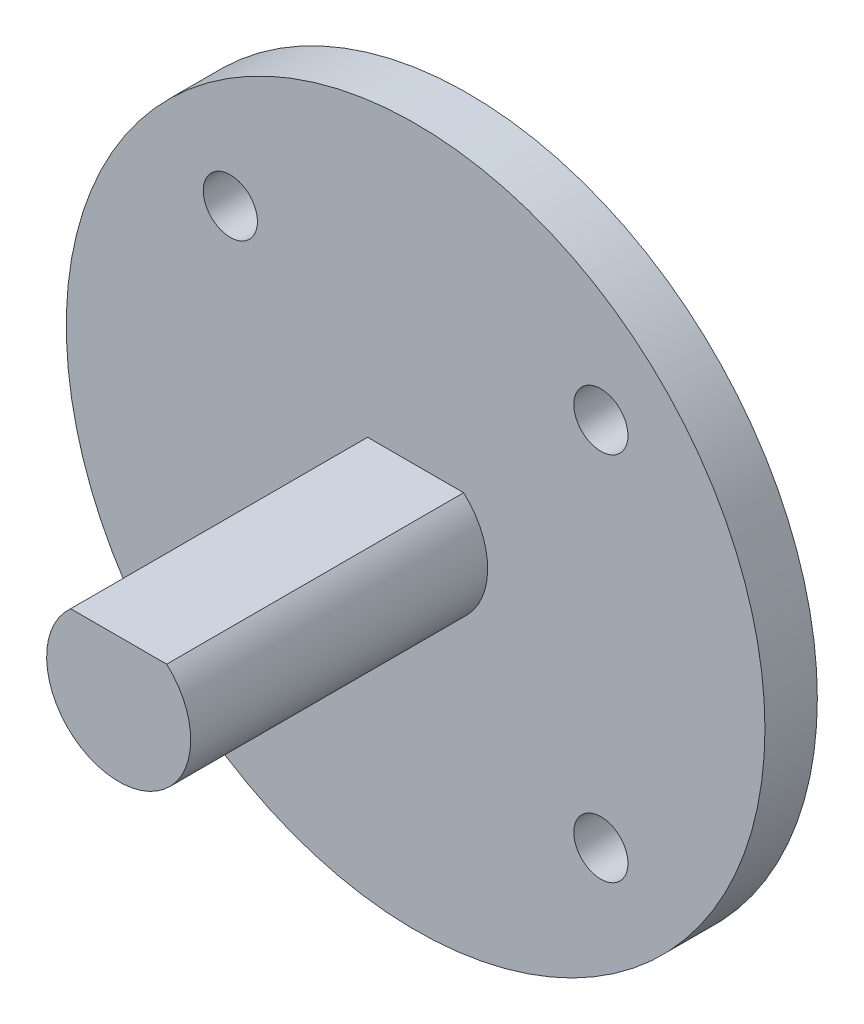
ISO-10303-21;
HEADER;
FILE_DESCRIPTION(('STEP AP214'),'2;1');
FILE_NAME('part.step','',(''),(''),'','','');
FILE_SCHEMA(('AUTOMOTIVE_DESIGN { 1 0 10303 214 1 1 1 1 }'));
ENDSEC;
DATA;
#1=APPLICATION_CONTEXT('core data for automotive mechanical design processes');
#2=APPLICATION_PROTOCOL_DEFINITION('international standard','automotive_design',2000,#1);
#3=PRODUCT_CONTEXT('',#1,'mechanical');
#4=PRODUCT('Part','Part','',(#3));
#5=PRODUCT_RELATED_PRODUCT_CATEGORY('part','',(#4));
#6=PRODUCT_DEFINITION_FORMATION('','',#4);
#7=PRODUCT_DEFINITION_CONTEXT('part definition',#1,'design');
#8=PRODUCT_DEFINITION('design','',#6,#7);
#9=PRODUCT_DEFINITION_SHAPE('','',#8);
#10=(LENGTH_UNIT() NAMED_UNIT(*) SI_UNIT(.MILLI.,.METRE.));
#11=(NAMED_UNIT(*) PLANE_ANGLE_UNIT() SI_UNIT($,.RADIAN.));
#12=(NAMED_UNIT(*) SI_UNIT($,.STERADIAN.) SOLID_ANGLE_UNIT());
#13=UNCERTAINTY_MEASURE_WITH_UNIT(LENGTH_MEASURE(1.E-05),#10,'distance_accuracy_value','');
#14=(GEOMETRIC_REPRESENTATION_CONTEXT(3) GLOBAL_UNCERTAINTY_ASSIGNED_CONTEXT((#13)) GLOBAL_UNIT_ASSIGNED_CONTEXT((#10,
#11,#12)) REPRESENTATION_CONTEXT('',''));
#15=CARTESIAN_POINT('',(0.,0.,0.));
#16=DIRECTION('',(0.,0.,1.));
#17=DIRECTION('',(1.,0.,0.));
#18=AXIS2_PLACEMENT_3D('',#15,#16,#17);
#19=CARTESIAN_POINT('',(10.6066017177982,10.6066017177982,3.));
#20=DIRECTION('',(0.,0.,-1.));
#21=DIRECTION('',(-1.,0.,0.));
#22=AXIS2_PLACEMENT_3D('',#19,#20,#21);
#23=CYLINDRICAL_SURFACE('',#22,1.55);
#24=CARTESIAN_POINT('',(10.6066017177982,10.6066017177982,3.));
#25=DIRECTION('',(0.,0.,1.));
#26=DIRECTION('',(1.,0.,0.));
#27=AXIS2_PLACEMENT_3D('',#24,#25,#26);
#28=CIRCLE('',#27,1.55);
#29=CARTESIAN_POINT('',(12.1566017177982,10.6066017177982,3.));
#30=VERTEX_POINT('',#29);
#31=EDGE_CURVE('E98',#30,#30,#28,.T.);
#32=ORIENTED_EDGE('',*,*,#31,.T.);
#33=EDGE_LOOP('',(#32));
#34=FACE_BOUND('',#33,.T.);
#35=CARTESIAN_POINT('',(10.6066017177982,10.6066017177982,0.));
#36=DIRECTION('',(0.,0.,1.));
#37=DIRECTION('',(1.,0.,0.));
#38=AXIS2_PLACEMENT_3D('',#35,#36,#37);
#39=CIRCLE('',#38,1.55);
#40=CARTESIAN_POINT('',(12.1566017177982,10.6066017177982,0.));
#41=VERTEX_POINT('',#40);
#42=EDGE_CURVE('E110',#41,#41,#39,.T.);
#43=ORIENTED_EDGE('',*,*,#42,.F.);
#44=EDGE_LOOP('',(#43));
#45=FACE_BOUND('',#44,.T.);
#46=ADVANCED_FACE('F43',(#34,#45),#23,.F.);
#47=CARTESIAN_POINT('',(10.6066017177982,-10.6066017177982,3.));
#48=DIRECTION('',(0.,0.,-1.));
#49=DIRECTION('',(-1.,0.,0.));
#50=AXIS2_PLACEMENT_3D('',#47,#48,#49);
#51=CYLINDRICAL_SURFACE('',#50,1.55);
#52=CARTESIAN_POINT('',(10.6066017177982,-10.6066017177982,3.));
#53=DIRECTION('',(0.,0.,1.));
#54=DIRECTION('',(1.,0.,0.));
#55=AXIS2_PLACEMENT_3D('',#52,#53,#54);
#56=CIRCLE('',#55,1.55);
#57=CARTESIAN_POINT('',(12.1566017177982,-10.6066017177982,3.));
#58=VERTEX_POINT('',#57);
#59=EDGE_CURVE('E95',#58,#58,#56,.T.);
#60=ORIENTED_EDGE('',*,*,#59,.T.);
#61=EDGE_LOOP('',(#60));
#62=FACE_BOUND('',#61,.T.);
#63=CARTESIAN_POINT('',(10.6066017177982,-10.6066017177982,0.));
#64=DIRECTION('',(0.,0.,1.));
#65=DIRECTION('',(1.,0.,0.));
#66=AXIS2_PLACEMENT_3D('',#63,#64,#65);
#67=CIRCLE('',#66,1.55);
#68=CARTESIAN_POINT('',(12.1566017177982,-10.6066017177982,0.));
#69=VERTEX_POINT('',#68);
#70=EDGE_CURVE('E108',#69,#69,#67,.T.);
#71=ORIENTED_EDGE('',*,*,#70,.F.);
#72=EDGE_LOOP('',(#71));
#73=FACE_BOUND('',#72,.T.);
#74=ADVANCED_FACE('F134',(#62,#73),#51,.F.);
#75=CARTESIAN_POINT('',(-10.6066017177983,-10.6066017177982,3.));
#76=DIRECTION('',(0.,0.,-1.));
#77=DIRECTION('',(-1.,0.,0.));
#78=AXIS2_PLACEMENT_3D('',#75,#76,#77);
#79=CYLINDRICAL_SURFACE('',#78,1.55);
#80=CARTESIAN_POINT('',(-10.6066017177983,-10.6066017177982,3.));
#81=DIRECTION('',(0.,0.,1.));
#82=DIRECTION('',(1.,0.,0.));
#83=AXIS2_PLACEMENT_3D('',#80,#81,#82);
#84=CIRCLE('',#83,1.55);
#85=CARTESIAN_POINT('',(-9.05660171779827,-10.6066017177982,3.));
#86=VERTEX_POINT('',#85);
#87=EDGE_CURVE('E92',#86,#86,#84,.T.);
#88=ORIENTED_EDGE('',*,*,#87,.T.);
#89=EDGE_LOOP('',(#88));
#90=FACE_BOUND('',#89,.T.);
#91=CARTESIAN_POINT('',(-10.6066017177983,-10.6066017177982,0.));
#92=DIRECTION('',(0.,0.,1.));
#93=DIRECTION('',(1.,0.,0.));
#94=AXIS2_PLACEMENT_3D('',#91,#92,#93);
#95=CIRCLE('',#94,1.55);
#96=CARTESIAN_POINT('',(-9.05660171779827,-10.6066017177982,0.));
#97=VERTEX_POINT('',#96);
#98=EDGE_CURVE('E105',#97,#97,#95,.T.);
#99=ORIENTED_EDGE('',*,*,#98,.F.);
#100=EDGE_LOOP('',(#99));
#101=FACE_BOUND('',#100,.T.);
#102=ADVANCED_FACE('F140',(#90,#101),#79,.F.);
#103=CARTESIAN_POINT('',(-10.6066017177983,10.6066017177982,3.));
#104=DIRECTION('',(0.,0.,-1.));
#105=DIRECTION('',(-1.,0.,0.));
#106=AXIS2_PLACEMENT_3D('',#103,#104,#105);
#107=CYLINDRICAL_SURFACE('',#106,1.55);
#108=CARTESIAN_POINT('',(-10.6066017177983,10.6066017177982,3.));
#109=DIRECTION('',(0.,0.,1.));
#110=DIRECTION('',(1.,0.,0.));
#111=AXIS2_PLACEMENT_3D('',#108,#109,#110);
#112=CIRCLE('',#111,1.55);
#113=CARTESIAN_POINT('',(-9.05660171779827,10.6066017177982,3.));
#114=VERTEX_POINT('',#113);
#115=EDGE_CURVE('E89',#114,#114,#112,.T.);
#116=ORIENTED_EDGE('',*,*,#115,.T.);
#117=EDGE_LOOP('',(#116));
#118=FACE_BOUND('',#117,.T.);
#119=CARTESIAN_POINT('',(-10.6066017177983,10.6066017177982,0.));
#120=DIRECTION('',(0.,0.,1.));
#121=DIRECTION('',(1.,0.,0.));
#122=AXIS2_PLACEMENT_3D('',#119,#120,#121);
#123=CIRCLE('',#122,1.55);
#124=CARTESIAN_POINT('',(-9.05660171779827,10.6066017177982,0.));
#125=VERTEX_POINT('',#124);
#126=EDGE_CURVE('E77',#125,#125,#123,.T.);
#127=ORIENTED_EDGE('',*,*,#126,.F.);
#128=EDGE_LOOP('',(#127));
#129=FACE_BOUND('',#128,.T.);
#130=ADVANCED_FACE('F45',(#118,#129),#107,.F.);
#131=CARTESIAN_POINT('',(0.,0.,3.));
#132=DIRECTION('',(0.,0.,-1.));
#133=DIRECTION('',(-1.,0.,0.));
#134=AXIS2_PLACEMENT_3D('',#131,#132,#133);
#135=CYLINDRICAL_SURFACE('',#134,20.);
#136=CARTESIAN_POINT('',(0.,0.,3.));
#137=DIRECTION('',(0.,0.,1.));
#138=DIRECTION('',(1.,0.,0.));
#139=AXIS2_PLACEMENT_3D('',#136,#137,#138);
#140=CIRCLE('',#139,20.);
#141=CARTESIAN_POINT('',(20.,0.,3.));
#142=VERTEX_POINT('',#141);
#143=EDGE_CURVE('E11',#142,#142,#140,.T.);
#144=ORIENTED_EDGE('',*,*,#143,.F.);
#145=EDGE_LOOP('',(#144));
#146=FACE_BOUND('',#145,.T.);
#147=CARTESIAN_POINT('',(0.,0.,0.));
#148=DIRECTION('',(0.,0.,1.));
#149=DIRECTION('',(1.,0.,0.));
#150=AXIS2_PLACEMENT_3D('',#147,#148,#149);
#151=CIRCLE('',#150,20.);
#152=CARTESIAN_POINT('',(20.,0.,0.));
#153=VERTEX_POINT('',#152);
#154=EDGE_CURVE('E47',#153,#153,#151,.T.);
#155=ORIENTED_EDGE('',*,*,#154,.T.);
#156=EDGE_LOOP('',(#155));
#157=FACE_BOUND('',#156,.T.);
#158=ADVANCED_FACE('F117',(#146,#157),#135,.T.);
#159=CARTESIAN_POINT('',(0.,0.,3.));
#160=DIRECTION('',(0.,0.,1.));
#161=DIRECTION('',(1.,0.,0.));
#162=AXIS2_PLACEMENT_3D('',#159,#160,#161);
#163=PLANE('',#162);
#164=ORIENTED_EDGE('',*,*,#115,.F.);
#165=EDGE_LOOP('',(#164));
#166=FACE_BOUND('',#165,.T.);
#167=ORIENTED_EDGE('',*,*,#87,.F.);
#168=EDGE_LOOP('',(#167));
#169=FACE_BOUND('',#168,.T.);
#170=ORIENTED_EDGE('',*,*,#59,.F.);
#171=EDGE_LOOP('',(#170));
#172=FACE_BOUND('',#171,.T.);
#173=ORIENTED_EDGE('',*,*,#31,.F.);
#174=EDGE_LOOP('',(#173));
#175=FACE_BOUND('',#174,.T.);
#176=CARTESIAN_POINT('',(0.,0.,3.));
#177=DIRECTION('',(0.,0.,1.));
#178=DIRECTION('',(1.,0.,0.));
#179=AXIS2_PLACEMENT_3D('',#176,#177,#178);
#180=CIRCLE('',#179,4.125);
#181=CARTESIAN_POINT('',(-2.7495454169735,3.075,3.));
#182=VERTEX_POINT('',#181);
#183=CARTESIAN_POINT('',(2.7495454169735,3.075,3.));
#184=VERTEX_POINT('',#183);
#185=EDGE_CURVE('E59',#182,#184,#180,.T.);
#186=ORIENTED_EDGE('',*,*,#185,.F.);
#187=DIRECTION('',(1.,0.,0.));
#188=VECTOR('',#187,1.);
#189=CARTESIAN_POINT('',(0.,3.075,3.));
#190=LINE('',#189,#188);
#191=EDGE_CURVE('E52',#182,#184,#190,.T.);
#192=ORIENTED_EDGE('',*,*,#191,.T.);
#193=EDGE_LOOP('',(#186,#192));
#194=FACE_BOUND('',#193,.T.);
#195=ORIENTED_EDGE('',*,*,#143,.T.);
#196=EDGE_LOOP('',(#195));
#197=FACE_BOUND('',#196,.T.);
#198=ADVANCED_FACE('F121',(#166,#169,#172,#175,#194,#197),#163,.T.);
#199=CARTESIAN_POINT('',(0.,0.,0.));
#200=DIRECTION('',(0.,0.,1.));
#201=DIRECTION('',(1.,0.,0.));
#202=AXIS2_PLACEMENT_3D('',#199,#200,#201);
#203=PLANE('',#202);
#204=ORIENTED_EDGE('',*,*,#126,.T.);
#205=EDGE_LOOP('',(#204));
#206=FACE_BOUND('',#205,.T.);
#207=ORIENTED_EDGE('',*,*,#98,.T.);
#208=EDGE_LOOP('',(#207));
#209=FACE_BOUND('',#208,.T.);
#210=ORIENTED_EDGE('',*,*,#70,.T.);
#211=EDGE_LOOP('',(#210));
#212=FACE_BOUND('',#211,.T.);
#213=ORIENTED_EDGE('',*,*,#42,.T.);
#214=EDGE_LOOP('',(#213));
#215=FACE_BOUND('',#214,.T.);
#216=ORIENTED_EDGE('',*,*,#154,.F.);
#217=EDGE_LOOP('',(#216));
#218=FACE_BOUND('',#217,.T.);
#219=ADVANCED_FACE('F119',(#206,#209,#212,#215,#218),#203,.F.);
#220=CARTESIAN_POINT('',(0.,3.075,20.));
#221=DIRECTION('',(0.,1.,0.));
#222=DIRECTION('',(0.,0.,1.));
#223=AXIS2_PLACEMENT_3D('',#220,#221,#222);
#224=PLANE('',#223);
#225=DIRECTION('',(0.,0.,-1.));
#226=VECTOR('',#225,1.);
#227=CARTESIAN_POINT('',(2.7495454169735,3.075,20.));
#228=LINE('',#227,#226);
#229=CARTESIAN_POINT('',(2.7495454169735,3.075,20.));
#230=VERTEX_POINT('',#229);
#231=EDGE_CURVE('E78',#230,#184,#228,.T.);
#232=ORIENTED_EDGE('',*,*,#231,.T.);
#233=ORIENTED_EDGE('',*,*,#191,.F.);
#234=DIRECTION('',(0.,0.,-1.));
#235=VECTOR('',#234,1.);
#236=CARTESIAN_POINT('',(-2.7495454169735,3.075,20.));
#237=LINE('',#236,#235);
#238=CARTESIAN_POINT('',(-2.7495454169735,3.075,20.));
#239=VERTEX_POINT('',#238);
#240=EDGE_CURVE('E70',#239,#182,#237,.T.);
#241=ORIENTED_EDGE('',*,*,#240,.F.);
#242=DIRECTION('',(1.,0.,0.));
#243=VECTOR('',#242,1.);
#244=CARTESIAN_POINT('',(0.,3.075,20.));
#245=LINE('',#244,#243);
#246=EDGE_CURVE('E75',#239,#230,#245,.T.);
#247=ORIENTED_EDGE('',*,*,#246,.T.);
#248=EDGE_LOOP('',(#232,#233,#241,#247));
#249=FACE_BOUND('',#248,.T.);
#250=ADVANCED_FACE('F73',(#249),#224,.T.);
#251=CARTESIAN_POINT('',(0.,0.,20.));
#252=DIRECTION('',(0.,0.,-1.));
#253=DIRECTION('',(-1.,0.,0.));
#254=AXIS2_PLACEMENT_3D('',#251,#252,#253);
#255=CYLINDRICAL_SURFACE('',#254,4.125);
#256=ORIENTED_EDGE('',*,*,#185,.T.);
#257=ORIENTED_EDGE('',*,*,#231,.F.);
#258=CARTESIAN_POINT('',(0.,0.,20.));
#259=DIRECTION('',(0.,0.,1.));
#260=DIRECTION('',(1.,0.,0.));
#261=AXIS2_PLACEMENT_3D('',#258,#259,#260);
#262=CIRCLE('',#261,4.125);
#263=EDGE_CURVE('E81',#239,#230,#262,.T.);
#264=ORIENTED_EDGE('',*,*,#263,.F.);
#265=ORIENTED_EDGE('',*,*,#240,.T.);
#266=EDGE_LOOP('',(#256,#257,#264,#265));
#267=FACE_BOUND('',#266,.T.);
#268=ADVANCED_FACE('F82',(#267),#255,.T.);
#269=CARTESIAN_POINT('',(0.,0.,20.));
#270=DIRECTION('',(0.,0.,1.));
#271=DIRECTION('',(1.,0.,0.));
#272=AXIS2_PLACEMENT_3D('',#269,#270,#271);
#273=PLANE('',#272);
#274=ORIENTED_EDGE('',*,*,#246,.F.);
#275=ORIENTED_EDGE('',*,*,#263,.T.);
#276=EDGE_LOOP('',(#274,#275));
#277=FACE_BOUND('',#276,.T.);
#278=ADVANCED_FACE('F85',(#277),#273,.T.);
#279=CLOSED_SHELL('',(#46,#74,#102,#130,#158,#198,#219,#250,#268,#278));
#280=MANIFOLD_SOLID_BREP('B2',#279);
#281=ADVANCED_BREP_SHAPE_REPRESENTATION('',(#18,#280),#14);
#282=SHAPE_DEFINITION_REPRESENTATION(#9,#281);
ENDSEC;
END-ISO-10303-21;
